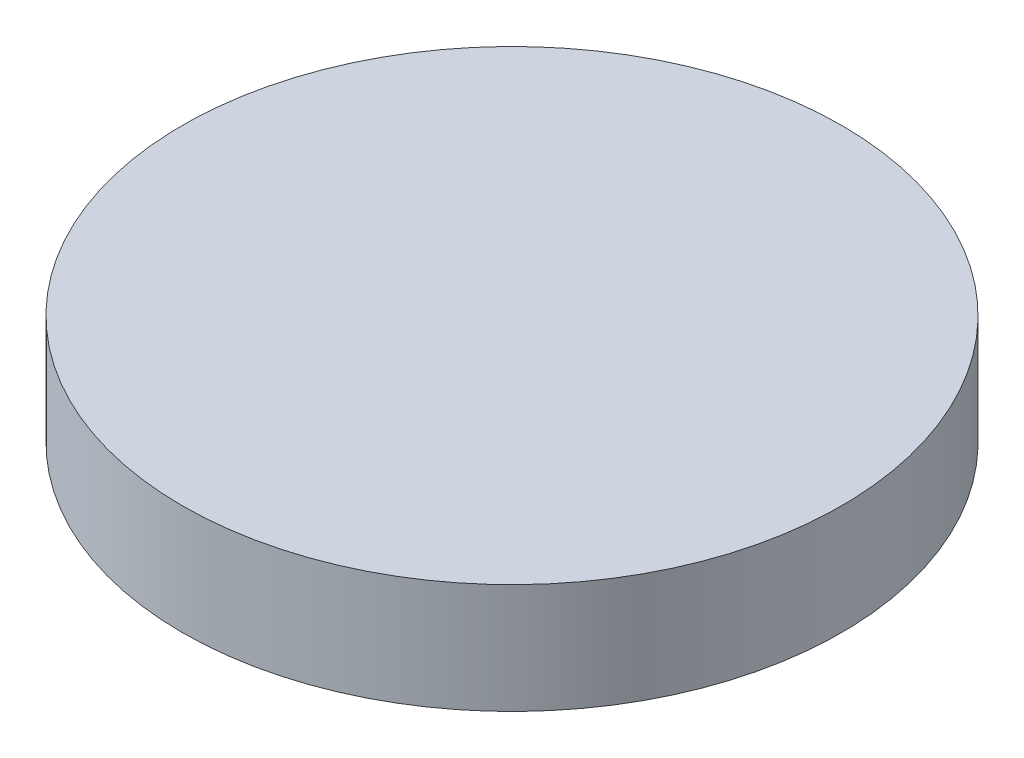
ISO-10303-21;
HEADER;
FILE_DESCRIPTION(('STEP AP214'),'2;1');
FILE_NAME('part.step','',(''),(''),'','','');
FILE_SCHEMA(('AUTOMOTIVE_DESIGN { 1 0 10303 214 1 1 1 1 }'));
ENDSEC;
DATA;
#1=APPLICATION_CONTEXT('core data for automotive mechanical design processes');
#2=APPLICATION_PROTOCOL_DEFINITION('international standard','automotive_design',2000,#1);
#3=PRODUCT_CONTEXT('',#1,'mechanical');
#4=PRODUCT('Part','Part','',(#3));
#5=PRODUCT_RELATED_PRODUCT_CATEGORY('part','',(#4));
#6=PRODUCT_DEFINITION_FORMATION('','',#4);
#7=PRODUCT_DEFINITION_CONTEXT('part definition',#1,'design');
#8=PRODUCT_DEFINITION('design','',#6,#7);
#9=PRODUCT_DEFINITION_SHAPE('','',#8);
#10=(LENGTH_UNIT() NAMED_UNIT(*) SI_UNIT(.MILLI.,.METRE.));
#11=(NAMED_UNIT(*) PLANE_ANGLE_UNIT() SI_UNIT($,.RADIAN.));
#12=(NAMED_UNIT(*) SI_UNIT($,.STERADIAN.) SOLID_ANGLE_UNIT());
#13=UNCERTAINTY_MEASURE_WITH_UNIT(LENGTH_MEASURE(1.E-05),#10,'distance_accuracy_value','');
#14=(GEOMETRIC_REPRESENTATION_CONTEXT(3) GLOBAL_UNCERTAINTY_ASSIGNED_CONTEXT((#13)) GLOBAL_UNIT_ASSIGNED_CONTEXT((#10,
#11,#12)) REPRESENTATION_CONTEXT('',''));
#15=CARTESIAN_POINT('',(0.,0.,0.));
#16=DIRECTION('',(0.,0.,1.));
#17=DIRECTION('',(1.,0.,0.));
#18=AXIS2_PLACEMENT_3D('',#15,#16,#17);
#19=CARTESIAN_POINT('',(0.,6.35,0.));
#20=DIRECTION('',(0.,-1.,0.));
#21=DIRECTION('',(0.,0.,-1.));
#22=AXIS2_PLACEMENT_3D('',#19,#20,#21);
#23=CYLINDRICAL_SURFACE('',#22,19.05);
#24=CARTESIAN_POINT('',(0.,6.35,0.));
#25=DIRECTION('',(0.,1.,0.));
#26=DIRECTION('',(0.,0.,1.));
#27=AXIS2_PLACEMENT_3D('',#24,#25,#26);
#28=CIRCLE('',#27,19.05);
#29=CARTESIAN_POINT('',(0.,6.35,19.05));
#30=VERTEX_POINT('',#29);
#31=EDGE_CURVE('E10',#30,#30,#28,.T.);
#32=ORIENTED_EDGE('',*,*,#31,.F.);
#33=EDGE_LOOP('',(#32));
#34=FACE_BOUND('',#33,.T.);
#35=CARTESIAN_POINT('',(0.,0.,0.));
#36=DIRECTION('',(0.,1.,0.));
#37=DIRECTION('',(0.,0.,1.));
#38=AXIS2_PLACEMENT_3D('',#35,#36,#37);
#39=CIRCLE('',#38,19.05);
#40=CARTESIAN_POINT('',(0.,0.,19.05));
#41=VERTEX_POINT('',#40);
#42=EDGE_CURVE('E37',#41,#41,#39,.T.);
#43=ORIENTED_EDGE('',*,*,#42,.T.);
#44=EDGE_LOOP('',(#43));
#45=FACE_BOUND('',#44,.T.);
#46=ADVANCED_FACE('F34',(#34,#45),#23,.T.);
#47=CARTESIAN_POINT('',(0.,6.35,0.));
#48=DIRECTION('',(0.,1.,0.));
#49=DIRECTION('',(0.,0.,1.));
#50=AXIS2_PLACEMENT_3D('',#47,#48,#49);
#51=PLANE('',#50);
#52=ORIENTED_EDGE('',*,*,#31,.T.);
#53=EDGE_LOOP('',(#52));
#54=FACE_BOUND('',#53,.T.);
#55=ADVANCED_FACE('F63',(#54),#51,.T.);
#56=CARTESIAN_POINT('',(0.,0.,0.));
#57=DIRECTION('',(0.,1.,0.));
#58=DIRECTION('',(0.,0.,1.));
#59=AXIS2_PLACEMENT_3D('',#56,#57,#58);
#60=PLANE('',#59);
#61=CARTESIAN_POINT('',(0.,0.,0.));
#62=DIRECTION('',(0.,-1.,0.));
#63=DIRECTION('',(0.,0.,-1.));
#64=AXIS2_PLACEMENT_3D('',#61,#62,#63);
#65=CIRCLE('',#64,17.653);
#66=CARTESIAN_POINT('',(0.,0.,-17.653));
#67=VERTEX_POINT('',#66);
#68=EDGE_CURVE('E46',#67,#67,#65,.T.);
#69=ORIENTED_EDGE('',*,*,#68,.F.);
#70=EDGE_LOOP('',(#69));
#71=FACE_BOUND('',#70,.T.);
#72=ORIENTED_EDGE('',*,*,#42,.F.);
#73=EDGE_LOOP('',(#72));
#74=FACE_BOUND('',#73,.T.);
#75=ADVANCED_FACE('F57',(#71,#74),#60,.F.);
#76=CARTESIAN_POINT('',(0.,2.8702,0.));
#77=DIRECTION('',(0.,-1.,0.));
#78=DIRECTION('',(0.,0.,-1.));
#79=AXIS2_PLACEMENT_3D('',#76,#77,#78);
#80=CYLINDRICAL_SURFACE('',#79,17.653);
#81=CARTESIAN_POINT('',(0.,2.8702,0.));
#82=DIRECTION('',(0.,-1.,0.));
#83=DIRECTION('',(0.,0.,-1.));
#84=AXIS2_PLACEMENT_3D('',#81,#82,#83);
#85=CIRCLE('',#84,17.653);
#86=CARTESIAN_POINT('',(0.,2.8702,-17.653));
#87=VERTEX_POINT('',#86);
#88=EDGE_CURVE('E44',#87,#87,#85,.T.);
#89=CARTESIAN_POINT('',(0.,2.8702,-17.653));
#90=CARTESIAN_POINT('',(0.,2.84030208333333,-17.653));
#91=CARTESIAN_POINT('',(0.,2.81040416666667,-17.653));
#92=CARTESIAN_POINT('',(0.,2.75060833333333,-17.653));
#93=CARTESIAN_POINT('',(0.,2.72071041666667,-17.653));
#94=CARTESIAN_POINT('',(0.,2.66091458333333,-17.653));
#95=CARTESIAN_POINT('',(0.,2.63101666666667,-17.653));
#96=CARTESIAN_POINT('',(0.,2.57122083333333,-17.653));
#97=CARTESIAN_POINT('',(0.,2.54132291666667,-17.653));
#98=CARTESIAN_POINT('',(0.,2.48152708333333,-17.653));
#99=CARTESIAN_POINT('',(0.,2.45162916666667,-17.653));
#100=CARTESIAN_POINT('',(0.,2.39183333333333,-17.653));
#101=CARTESIAN_POINT('',(0.,2.36193541666667,-17.653));
#102=CARTESIAN_POINT('',(0.,2.30213958333333,-17.653));
#103=CARTESIAN_POINT('',(0.,2.27224166666667,-17.653));
#104=CARTESIAN_POINT('',(0.,2.21244583333333,-17.653));
#105=CARTESIAN_POINT('',(0.,2.18254791666667,-17.653));
#106=CARTESIAN_POINT('',(0.,2.12275208333333,-17.653));
#107=CARTESIAN_POINT('',(0.,2.09285416666667,-17.653));
#108=CARTESIAN_POINT('',(0.,2.03305833333333,-17.653));
#109=CARTESIAN_POINT('',(0.,2.00316041666667,-17.653));
#110=CARTESIAN_POINT('',(0.,1.94336458333333,-17.653));
#111=CARTESIAN_POINT('',(0.,1.91346666666667,-17.653));
#112=CARTESIAN_POINT('',(0.,1.85367083333333,-17.653));
#113=CARTESIAN_POINT('',(0.,1.82377291666667,-17.653));
#114=CARTESIAN_POINT('',(0.,1.76397708333333,-17.653));
#115=CARTESIAN_POINT('',(0.,1.73407916666667,-17.653));
#116=CARTESIAN_POINT('',(0.,1.67428333333333,-17.653));
#117=CARTESIAN_POINT('',(0.,1.64438541666667,-17.653));
#118=CARTESIAN_POINT('',(0.,1.58458958333333,-17.653));
#119=CARTESIAN_POINT('',(0.,1.55469166666667,-17.653));
#120=CARTESIAN_POINT('',(0.,1.49489583333333,-17.653));
#121=CARTESIAN_POINT('',(0.,1.46499791666667,-17.653));
#122=CARTESIAN_POINT('',(0.,1.40520208333333,-17.653));
#123=CARTESIAN_POINT('',(0.,1.37530416666667,-17.653));
#124=CARTESIAN_POINT('',(0.,1.31550833333333,-17.653));
#125=CARTESIAN_POINT('',(0.,1.28561041666667,-17.653));
#126=CARTESIAN_POINT('',(0.,1.22581458333333,-17.653));
#127=CARTESIAN_POINT('',(0.,1.19591666666667,-17.653));
#128=CARTESIAN_POINT('',(0.,1.13612083333333,-17.653));
#129=CARTESIAN_POINT('',(0.,1.10622291666667,-17.653));
#130=CARTESIAN_POINT('',(0.,1.04642708333333,-17.653));
#131=CARTESIAN_POINT('',(0.,1.01652916666667,-17.653));
#132=CARTESIAN_POINT('',(0.,0.956733333333334,-17.653));
#133=CARTESIAN_POINT('',(0.,0.926835416666667,-17.653));
#134=CARTESIAN_POINT('',(0.,0.867039583333334,-17.653));
#135=CARTESIAN_POINT('',(0.,0.837141666666667,-17.653));
#136=CARTESIAN_POINT('',(0.,0.777345833333334,-17.653));
#137=CARTESIAN_POINT('',(0.,0.747447916666667,-17.653));
#138=CARTESIAN_POINT('',(0.,0.687652083333334,-17.653));
#139=CARTESIAN_POINT('',(0.,0.657754166666667,-17.653));
#140=CARTESIAN_POINT('',(0.,0.597958333333334,-17.653));
#141=CARTESIAN_POINT('',(0.,0.568060416666667,-17.653));
#142=CARTESIAN_POINT('',(0.,0.508264583333334,-17.653));
#143=CARTESIAN_POINT('',(0.,0.478366666666667,-17.653));
#144=CARTESIAN_POINT('',(0.,0.418570833333334,-17.653));
#145=CARTESIAN_POINT('',(0.,0.388672916666667,-17.653));
#146=CARTESIAN_POINT('',(0.,0.328877083333334,-17.653));
#147=CARTESIAN_POINT('',(0.,0.298979166666667,-17.653));
#148=CARTESIAN_POINT('',(0.,0.239183333333334,-17.653));
#149=CARTESIAN_POINT('',(0.,0.209285416666667,-17.653));
#150=CARTESIAN_POINT('',(0.,0.149489583333334,-17.653));
#151=CARTESIAN_POINT('',(0.,0.119591666666667,-17.653));
#152=CARTESIAN_POINT('',(0.,0.0597958333333338,-17.653));
#153=CARTESIAN_POINT('',(0.,0.0298979166666671,-17.653));
#154=CARTESIAN_POINT('',(0.,0.,-17.653));
#155=B_SPLINE_CURVE_WITH_KNOTS('',3,(#89,#90,#91,#92,#93,#94,#95,#96,#97,#98,#99,#100,#101,#102,
#103,#104,#105,#106,#107,#108,#109,#110,#111,#112,#113,#114,#115,#116,#117,#118,#119,#120,#121,
#122,#123,#124,#125,#126,#127,#128,#129,#130,#131,#132,#133,#134,#135,#136,#137,#138,#139,#140,
#141,#142,#143,#144,#145,#146,#147,#148,#149,#150,#151,#152,#153,#154),.UNSPECIFIED.,.F.,.F.,(4,
2,2,2,2,2,2,2,2,2,2,2,2,2,2,2,2,2,2,2,2,2,2,2,2,2,2,2,2,2,2,2,4),(0.,0.0896937499999997,
0.1793875,0.26908125,0.358775,0.44846875,0.5381625,0.627856249999999,0.71755,0.80724375,
0.8969375,0.986631249999999,1.076325,1.16601875,1.2557125,1.34540625,1.4351,1.52479375,
1.6144875,1.70418125,1.793875,1.88356875,1.9732625,2.06295625,2.15265,2.24234375,2.3320375,
2.42173125,2.511425,2.60111875,2.6908125,2.78050625,2.8702),.UNSPECIFIED.);
#156=EDGE_CURVE('BSEAM54',#87,#67,#155,.T.);
#157=ORIENTED_EDGE('',*,*,#88,.F.);
#158=ORIENTED_EDGE('',*,*,#68,.T.);
#159=ORIENTED_EDGE('',*,*,#156,.T.);
#160=ORIENTED_EDGE('',*,*,#156,.F.);
#161=EDGE_LOOP('',(#157,#159,#158,#160));
#162=FACE_BOUND('',#161,.T.);
#163=ADVANCED_FACE('F54',(#162),#80,.F.);
#164=CARTESIAN_POINT('',(0.,2.8702,0.));
#165=DIRECTION('',(0.,-1.,0.));
#166=DIRECTION('',(0.,0.,-1.));
#167=AXIS2_PLACEMENT_3D('',#164,#165,#166);
#168=PLANE('',#167);
#169=ORIENTED_EDGE('',*,*,#88,.T.);
#170=EDGE_LOOP('',(#169));
#171=FACE_BOUND('',#170,.T.);
#172=ADVANCED_FACE('F52',(#171),#168,.T.);
#173=CLOSED_SHELL('',(#46,#55,#75,#163,#172));
#174=MANIFOLD_SOLID_BREP('B2',#173);
#175=ADVANCED_BREP_SHAPE_REPRESENTATION('',(#18,#174),#14);
#176=SHAPE_DEFINITION_REPRESENTATION(#9,#175);
ENDSEC;
END-ISO-10303-21;
